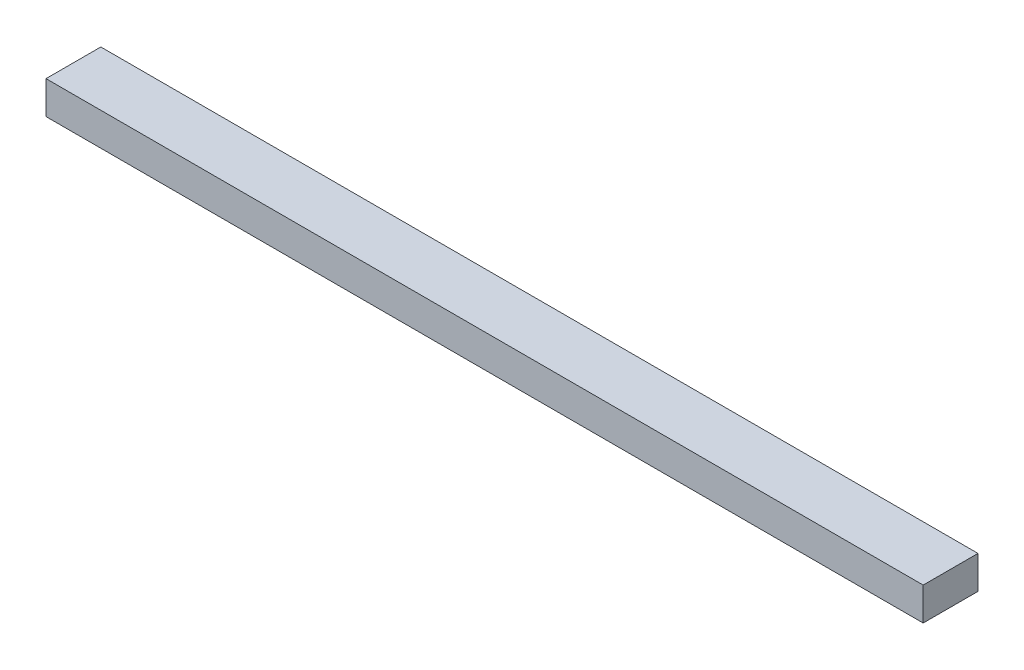
ISO-10303-21;
HEADER;
FILE_DESCRIPTION(('STEP AP214'),'2;1');
FILE_NAME('part.step','',(''),(''),'','','');
FILE_SCHEMA(('AUTOMOTIVE_DESIGN { 1 0 10303 214 1 1 1 1 }'));
ENDSEC;
DATA;
#1=APPLICATION_CONTEXT('core data for automotive mechanical design processes');
#2=APPLICATION_PROTOCOL_DEFINITION('international standard','automotive_design',2000,#1);
#3=PRODUCT_CONTEXT('',#1,'mechanical');
#4=PRODUCT('Part','Part','',(#3));
#5=PRODUCT_RELATED_PRODUCT_CATEGORY('part','',(#4));
#6=PRODUCT_DEFINITION_FORMATION('','',#4);
#7=PRODUCT_DEFINITION_CONTEXT('part definition',#1,'design');
#8=PRODUCT_DEFINITION('design','',#6,#7);
#9=PRODUCT_DEFINITION_SHAPE('','',#8);
#10=(LENGTH_UNIT() NAMED_UNIT(*) SI_UNIT(.MILLI.,.METRE.));
#11=(NAMED_UNIT(*) PLANE_ANGLE_UNIT() SI_UNIT($,.RADIAN.));
#12=(NAMED_UNIT(*) SI_UNIT($,.STERADIAN.) SOLID_ANGLE_UNIT());
#13=UNCERTAINTY_MEASURE_WITH_UNIT(LENGTH_MEASURE(1.E-05),#10,'distance_accuracy_value','');
#14=(GEOMETRIC_REPRESENTATION_CONTEXT(3) GLOBAL_UNCERTAINTY_ASSIGNED_CONTEXT((#13)) GLOBAL_UNIT_ASSIGNED_CONTEXT((#10,
#11,#12)) REPRESENTATION_CONTEXT('',''));
#15=CARTESIAN_POINT('',(0.,0.,0.));
#16=DIRECTION('',(0.,0.,1.));
#17=DIRECTION('',(1.,0.,0.));
#18=AXIS2_PLACEMENT_3D('',#15,#16,#17);
#19=CARTESIAN_POINT('',(-80.,6.,-5.));
#20=DIRECTION('',(1.,0.,0.));
#21=DIRECTION('',(0.,0.,-1.));
#22=AXIS2_PLACEMENT_3D('',#19,#20,#21);
#23=PLANE('',#22);
#24=DIRECTION('',(0.,0.,1.));
#25=VECTOR('',#24,1.);
#26=CARTESIAN_POINT('',(-80.,0.,-5.));
#27=LINE('',#26,#25);
#28=CARTESIAN_POINT('',(-80.,0.,-5.));
#29=VERTEX_POINT('',#28);
#30=CARTESIAN_POINT('',(-80.,0.,5.));
#31=VERTEX_POINT('',#30);
#32=EDGE_CURVE('E96',#29,#31,#27,.T.);
#33=ORIENTED_EDGE('',*,*,#32,.T.);
#34=DIRECTION('',(0.,-1.,0.));
#35=VECTOR('',#34,1.);
#36=CARTESIAN_POINT('',(-80.,6.,5.));
#37=LINE('',#36,#35);
#38=CARTESIAN_POINT('',(-80.,6.,5.));
#39=VERTEX_POINT('',#38);
#40=EDGE_CURVE('E11',#39,#31,#37,.T.);
#41=ORIENTED_EDGE('',*,*,#40,.F.);
#42=DIRECTION('',(0.,0.,1.));
#43=VECTOR('',#42,1.);
#44=CARTESIAN_POINT('',(-80.,6.,-5.));
#45=LINE('',#44,#43);
#46=CARTESIAN_POINT('',(-80.,6.,-5.));
#47=VERTEX_POINT('',#46);
#48=EDGE_CURVE('E84',#47,#39,#45,.T.);
#49=ORIENTED_EDGE('',*,*,#48,.F.);
#50=DIRECTION('',(0.,-1.,0.));
#51=VECTOR('',#50,1.);
#52=CARTESIAN_POINT('',(-80.,6.,-5.));
#53=LINE('',#52,#51);
#54=EDGE_CURVE('E92',#47,#29,#53,.T.);
#55=ORIENTED_EDGE('',*,*,#54,.T.);
#56=EDGE_LOOP('',(#33,#41,#49,#55));
#57=FACE_BOUND('',#56,.T.);
#58=ADVANCED_FACE('F33',(#57),#23,.F.);
#59=CARTESIAN_POINT('',(-80.,6.,5.));
#60=DIRECTION('',(0.,0.,-1.));
#61=DIRECTION('',(-1.,0.,0.));
#62=AXIS2_PLACEMENT_3D('',#59,#60,#61);
#63=PLANE('',#62);
#64=DIRECTION('',(1.,0.,0.));
#65=VECTOR('',#64,1.);
#66=CARTESIAN_POINT('',(-80.,0.,5.));
#67=LINE('',#66,#65);
#68=CARTESIAN_POINT('',(80.,0.,5.));
#69=VERTEX_POINT('',#68);
#70=EDGE_CURVE('E88',#31,#69,#67,.T.);
#71=ORIENTED_EDGE('',*,*,#70,.T.);
#72=DIRECTION('',(0.,-1.,0.));
#73=VECTOR('',#72,1.);
#74=CARTESIAN_POINT('',(80.,6.,5.));
#75=LINE('',#74,#73);
#76=CARTESIAN_POINT('',(80.,6.,5.));
#77=VERTEX_POINT('',#76);
#78=EDGE_CURVE('E41',#77,#69,#75,.T.);
#79=ORIENTED_EDGE('',*,*,#78,.F.);
#80=DIRECTION('',(1.,0.,0.));
#81=VECTOR('',#80,1.);
#82=CARTESIAN_POINT('',(-80.,6.,5.));
#83=LINE('',#82,#81);
#84=EDGE_CURVE('E79',#39,#77,#83,.T.);
#85=ORIENTED_EDGE('',*,*,#84,.F.);
#86=ORIENTED_EDGE('',*,*,#40,.T.);
#87=EDGE_LOOP('',(#71,#79,#85,#86));
#88=FACE_BOUND('',#87,.T.);
#89=ADVANCED_FACE('F87',(#88),#63,.F.);
#90=CARTESIAN_POINT('',(80.,6.,-5.));
#91=DIRECTION('',(-1.,0.,0.));
#92=DIRECTION('',(0.,0.,1.));
#93=AXIS2_PLACEMENT_3D('',#90,#91,#92);
#94=PLANE('',#93);
#95=DIRECTION('',(0.,0.,-1.));
#96=VECTOR('',#95,1.);
#97=CARTESIAN_POINT('',(80.,0.,-5.));
#98=LINE('',#97,#96);
#99=CARTESIAN_POINT('',(80.,0.,-5.));
#100=VERTEX_POINT('',#99);
#101=EDGE_CURVE('E66',#69,#100,#98,.T.);
#102=ORIENTED_EDGE('',*,*,#101,.T.);
#103=DIRECTION('',(0.,-1.,0.));
#104=VECTOR('',#103,1.);
#105=CARTESIAN_POINT('',(80.,6.,-5.));
#106=LINE('',#105,#104);
#107=CARTESIAN_POINT('',(80.,6.,-5.));
#108=VERTEX_POINT('',#107);
#109=EDGE_CURVE('E89',#108,#100,#106,.T.);
#110=ORIENTED_EDGE('',*,*,#109,.F.);
#111=DIRECTION('',(0.,0.,-1.));
#112=VECTOR('',#111,1.);
#113=CARTESIAN_POINT('',(80.,6.,-5.));
#114=LINE('',#113,#112);
#115=EDGE_CURVE('E82',#77,#108,#114,.T.);
#116=ORIENTED_EDGE('',*,*,#115,.F.);
#117=ORIENTED_EDGE('',*,*,#78,.T.);
#118=EDGE_LOOP('',(#102,#110,#116,#117));
#119=FACE_BOUND('',#118,.T.);
#120=ADVANCED_FACE('F90',(#119),#94,.F.);
#121=CARTESIAN_POINT('',(-80.,6.,-5.));
#122=DIRECTION('',(0.,0.,1.));
#123=DIRECTION('',(1.,0.,0.));
#124=AXIS2_PLACEMENT_3D('',#121,#122,#123);
#125=PLANE('',#124);
#126=DIRECTION('',(-1.,0.,0.));
#127=VECTOR('',#126,1.);
#128=CARTESIAN_POINT('',(-80.,0.,-5.));
#129=LINE('',#128,#127);
#130=EDGE_CURVE('E72',#100,#29,#129,.T.);
#131=ORIENTED_EDGE('',*,*,#130,.T.);
#132=ORIENTED_EDGE('',*,*,#54,.F.);
#133=DIRECTION('',(-1.,0.,0.));
#134=VECTOR('',#133,1.);
#135=CARTESIAN_POINT('',(-80.,6.,-5.));
#136=LINE('',#135,#134);
#137=EDGE_CURVE('E49',#108,#47,#136,.T.);
#138=ORIENTED_EDGE('',*,*,#137,.F.);
#139=ORIENTED_EDGE('',*,*,#109,.T.);
#140=EDGE_LOOP('',(#131,#132,#138,#139));
#141=FACE_BOUND('',#140,.T.);
#142=ADVANCED_FACE('F103',(#141),#125,.F.);
#143=CARTESIAN_POINT('',(0.,6.,0.));
#144=DIRECTION('',(0.,1.,0.));
#145=DIRECTION('',(0.,0.,1.));
#146=AXIS2_PLACEMENT_3D('',#143,#144,#145);
#147=PLANE('',#146);
#148=ORIENTED_EDGE('',*,*,#48,.T.);
#149=ORIENTED_EDGE('',*,*,#84,.T.);
#150=ORIENTED_EDGE('',*,*,#115,.T.);
#151=ORIENTED_EDGE('',*,*,#137,.T.);
#152=EDGE_LOOP('',(#148,#149,#150,#151));
#153=FACE_BOUND('',#152,.T.);
#154=ADVANCED_FACE('F80',(#153),#147,.T.);
#155=CARTESIAN_POINT('',(0.,0.,0.));
#156=DIRECTION('',(0.,1.,0.));
#157=DIRECTION('',(0.,0.,1.));
#158=AXIS2_PLACEMENT_3D('',#155,#156,#157);
#159=PLANE('',#158);
#160=ORIENTED_EDGE('',*,*,#32,.F.);
#161=ORIENTED_EDGE('',*,*,#130,.F.);
#162=ORIENTED_EDGE('',*,*,#101,.F.);
#163=ORIENTED_EDGE('',*,*,#70,.F.);
#164=EDGE_LOOP('',(#160,#161,#162,#163));
#165=FACE_BOUND('',#164,.T.);
#166=ADVANCED_FACE('F106',(#165),#159,.F.);
#167=CLOSED_SHELL('',(#58,#89,#120,#142,#154,#166));
#168=MANIFOLD_SOLID_BREP('B2',#167);
#169=ADVANCED_BREP_SHAPE_REPRESENTATION('',(#18,#168),#14);
#170=SHAPE_DEFINITION_REPRESENTATION(#9,#169);
ENDSEC;
END-ISO-10303-21;
